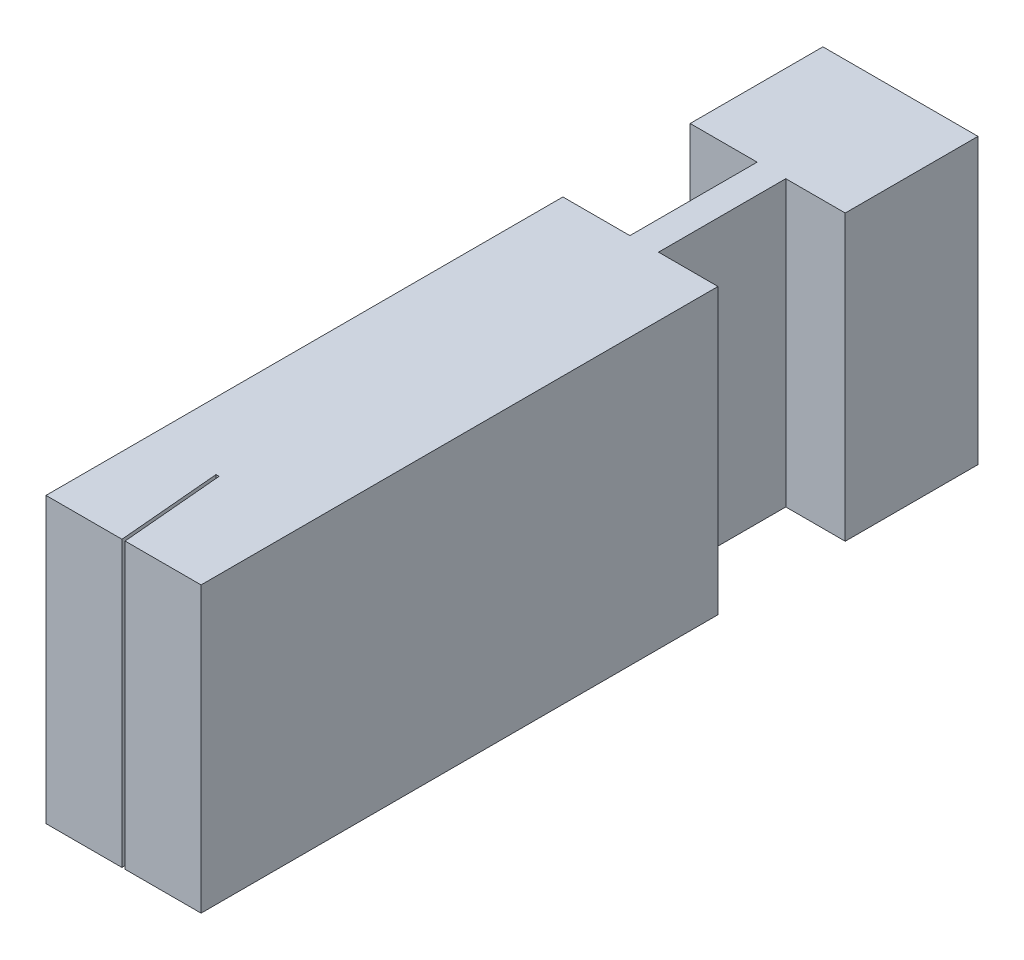
ISO-10303-21;
HEADER;
FILE_DESCRIPTION(('STEP AP214'),'2;1');
FILE_NAME('part.step','',(''),(''),'','','');
FILE_SCHEMA(('AUTOMOTIVE_DESIGN { 1 0 10303 214 1 1 1 1 }'));
ENDSEC;
DATA;
#1=APPLICATION_CONTEXT('core data for automotive mechanical design processes');
#2=APPLICATION_PROTOCOL_DEFINITION('international standard','automotive_design',2000,#1);
#3=PRODUCT_CONTEXT('',#1,'mechanical');
#4=PRODUCT('Part','Part','',(#3));
#5=PRODUCT_RELATED_PRODUCT_CATEGORY('part','',(#4));
#6=PRODUCT_DEFINITION_FORMATION('','',#4);
#7=PRODUCT_DEFINITION_CONTEXT('part definition',#1,'design');
#8=PRODUCT_DEFINITION('design','',#6,#7);
#9=PRODUCT_DEFINITION_SHAPE('','',#8);
#10=(LENGTH_UNIT() NAMED_UNIT(*) SI_UNIT(.MILLI.,.METRE.));
#11=(NAMED_UNIT(*) PLANE_ANGLE_UNIT() SI_UNIT($,.RADIAN.));
#12=(NAMED_UNIT(*) SI_UNIT($,.STERADIAN.) SOLID_ANGLE_UNIT());
#13=UNCERTAINTY_MEASURE_WITH_UNIT(LENGTH_MEASURE(1.E-05),#10,'distance_accuracy_value','');
#14=(GEOMETRIC_REPRESENTATION_CONTEXT(3) GLOBAL_UNCERTAINTY_ASSIGNED_CONTEXT((#13)) GLOBAL_UNIT_ASSIGNED_CONTEXT((#10,
#11,#12)) REPRESENTATION_CONTEXT('',''));
#15=CARTESIAN_POINT('',(0.,0.,0.));
#16=DIRECTION('',(0.,0.,1.));
#17=DIRECTION('',(1.,0.,0.));
#18=AXIS2_PLACEMENT_3D('',#15,#16,#17);
#19=CARTESIAN_POINT('',(-2.44711398691685E-06,55.,-100.));
#20=DIRECTION('',(1.,0.,-2.44711398691685E-08));
#21=DIRECTION('',(-2.44711398691685E-08,0.,-1.));
#22=AXIS2_PLACEMENT_3D('',#19,#20,#21);
#23=PLANE('',#22);
#24=DIRECTION('',(2.44711398691685E-08,0.,1.));
#25=VECTOR('',#24,1.);
#26=CARTESIAN_POINT('',(-2.44711398691685E-06,0.,-100.));
#27=LINE('',#26,#25);
#28=CARTESIAN_POINT('',(-2.44711398691685E-06,0.,-100.));
#29=VERTEX_POINT('',#28);
#30=CARTESIAN_POINT('',(0.,0.,0.));
#31=VERTEX_POINT('',#30);
#32=EDGE_CURVE('E194',#29,#31,#27,.T.);
#33=ORIENTED_EDGE('',*,*,#32,.T.);
#34=DIRECTION('',(0.,-1.,0.));
#35=VECTOR('',#34,1.);
#36=CARTESIAN_POINT('',(0.,55.,0.));
#37=LINE('',#36,#35);
#38=CARTESIAN_POINT('',(0.,55.,0.));
#39=VERTEX_POINT('',#38);
#40=EDGE_CURVE('E11',#39,#31,#37,.T.);
#41=ORIENTED_EDGE('',*,*,#40,.F.);
#42=DIRECTION('',(2.44711398691685E-08,0.,1.));
#43=VECTOR('',#42,1.);
#44=CARTESIAN_POINT('',(-2.44711398691685E-06,55.,-100.));
#45=LINE('',#44,#43);
#46=CARTESIAN_POINT('',(-2.44711398691685E-06,55.,-100.));
#47=VERTEX_POINT('',#46);
#48=EDGE_CURVE('E240',#47,#39,#45,.T.);
#49=ORIENTED_EDGE('',*,*,#48,.F.);
#50=DIRECTION('',(0.,-1.,0.));
#51=VECTOR('',#50,1.);
#52=CARTESIAN_POINT('',(-2.44711398691685E-06,55.,-100.));
#53=LINE('',#52,#51);
#54=EDGE_CURVE('E190',#47,#29,#53,.T.);
#55=ORIENTED_EDGE('',*,*,#54,.T.);
#56=EDGE_LOOP('',(#33,#41,#49,#55));
#57=FACE_BOUND('',#56,.T.);
#58=ADVANCED_FACE('F45',(#57),#23,.F.);
#59=CARTESIAN_POINT('',(0.,55.,0.));
#60=DIRECTION('',(0.,0.,-1.));
#61=DIRECTION('',(-1.,0.,0.));
#62=AXIS2_PLACEMENT_3D('',#59,#60,#61);
#63=PLANE('',#62);
#64=DIRECTION('',(1.,0.,0.));
#65=VECTOR('',#64,1.);
#66=CARTESIAN_POINT('',(0.,0.,0.));
#67=LINE('',#66,#65);
#68=CARTESIAN_POINT('',(14.7,0.,0.));
#69=VERTEX_POINT('',#68);
#70=EDGE_CURVE('E198',#31,#69,#67,.T.);
#71=ORIENTED_EDGE('',*,*,#70,.T.);
#72=DIRECTION('',(0.,-1.,0.));
#73=VECTOR('',#72,1.);
#74=CARTESIAN_POINT('',(14.7,55.,0.));
#75=LINE('',#74,#73);
#76=CARTESIAN_POINT('',(14.7,55.,0.));
#77=VERTEX_POINT('',#76);
#78=EDGE_CURVE('E54',#77,#69,#75,.T.);
#79=ORIENTED_EDGE('',*,*,#78,.F.);
#80=DIRECTION('',(1.,0.,0.));
#81=VECTOR('',#80,1.);
#82=CARTESIAN_POINT('',(0.,55.,0.));
#83=LINE('',#82,#81);
#84=EDGE_CURVE('E129',#39,#77,#83,.T.);
#85=ORIENTED_EDGE('',*,*,#84,.F.);
#86=ORIENTED_EDGE('',*,*,#40,.T.);
#87=EDGE_LOOP('',(#71,#79,#85,#86));
#88=FACE_BOUND('',#87,.T.);
#89=ADVANCED_FACE('F362',(#88),#63,.F.);
#90=CARTESIAN_POINT('',(14.7,55.,0.));
#91=DIRECTION('',(-0.996194698091746,0.,0.087155742747655));
#92=DIRECTION('',(0.087155742747655,0.,0.996194698091746));
#93=AXIS2_PLACEMENT_3D('',#90,#91,#92);
#94=PLANE('',#93);
#95=DIRECTION('',(-0.087155742747655,0.,-0.996194698091746));
#96=VECTOR('',#95,1.);
#97=CARTESIAN_POINT('',(14.7,0.,0.));
#98=LINE('',#97,#96);
#99=CARTESIAN_POINT('',(12.9568851450469,0.,-19.9238939618349));
#100=VERTEX_POINT('',#99);
#101=EDGE_CURVE('E201',#69,#100,#98,.T.);
#102=ORIENTED_EDGE('',*,*,#101,.T.);
#103=DIRECTION('',(0.,-1.,0.));
#104=VECTOR('',#103,1.);
#105=CARTESIAN_POINT('',(12.9568851450469,55.,-19.9238939618349));
#106=LINE('',#105,#104);
#107=CARTESIAN_POINT('',(12.9568851450469,55.,-19.9238939618349));
#108=VERTEX_POINT('',#107);
#109=EDGE_CURVE('E283',#108,#100,#106,.T.);
#110=ORIENTED_EDGE('',*,*,#109,.F.);
#111=DIRECTION('',(-0.087155742747655,0.,-0.996194698091746));
#112=VECTOR('',#111,1.);
#113=CARTESIAN_POINT('',(14.7,55.,0.));
#114=LINE('',#113,#112);
#115=EDGE_CURVE('E293',#77,#108,#114,.T.);
#116=ORIENTED_EDGE('',*,*,#115,.F.);
#117=ORIENTED_EDGE('',*,*,#78,.T.);
#118=EDGE_LOOP('',(#102,#110,#116,#117));
#119=FACE_BOUND('',#118,.T.);
#120=ADVANCED_FACE('F291',(#119),#94,.F.);
#121=CARTESIAN_POINT('',(12.9568851450469,55.,-19.9238939618349));
#122=DIRECTION('',(0.,0.,-1.));
#123=DIRECTION('',(-1.,0.,0.));
#124=AXIS2_PLACEMENT_3D('',#121,#122,#123);
#125=PLANE('',#124);
#126=DIRECTION('',(1.,0.,0.));
#127=VECTOR('',#126,1.);
#128=CARTESIAN_POINT('',(12.9568851450469,0.,-19.9238939618349));
#129=LINE('',#128,#127);
#130=CARTESIAN_POINT('',(13.5568851450469,0.,-19.9238939618349));
#131=VERTEX_POINT('',#130);
#132=EDGE_CURVE('E204',#100,#131,#129,.T.);
#133=ORIENTED_EDGE('',*,*,#132,.T.);
#134=DIRECTION('',(0.,-1.,0.));
#135=VECTOR('',#134,1.);
#136=CARTESIAN_POINT('',(13.5568851450469,55.,-19.9238939618349));
#137=LINE('',#136,#135);
#138=CARTESIAN_POINT('',(13.5568851450469,55.,-19.9238939618349));
#139=VERTEX_POINT('',#138);
#140=EDGE_CURVE('E279',#139,#131,#137,.T.);
#141=ORIENTED_EDGE('',*,*,#140,.F.);
#142=DIRECTION('',(1.,0.,0.));
#143=VECTOR('',#142,1.);
#144=CARTESIAN_POINT('',(12.9568851450469,55.,-19.9238939618349));
#145=LINE('',#144,#143);
#146=EDGE_CURVE('E312',#108,#139,#145,.T.);
#147=ORIENTED_EDGE('',*,*,#146,.F.);
#148=ORIENTED_EDGE('',*,*,#109,.T.);
#149=EDGE_LOOP('',(#133,#141,#147,#148));
#150=FACE_BOUND('',#149,.T.);
#151=ADVANCED_FACE('F302',(#150),#125,.F.);
#152=CARTESIAN_POINT('',(13.5568851450469,55.,-19.9238939618349));
#153=DIRECTION('',(0.996194698091746,0.,-0.0871557427476548));
#154=DIRECTION('',(-0.0871557427476548,0.,-0.996194698091746));
#155=AXIS2_PLACEMENT_3D('',#152,#153,#154);
#156=PLANE('',#155);
#157=DIRECTION('',(0.0871557427476548,0.,0.996194698091746));
#158=VECTOR('',#157,1.);
#159=CARTESIAN_POINT('',(13.5568851450469,0.,-19.9238939618349));
#160=LINE('',#159,#158);
#161=CARTESIAN_POINT('',(15.3,0.,0.));
#162=VERTEX_POINT('',#161);
#163=EDGE_CURVE('E207',#131,#162,#160,.T.);
#164=ORIENTED_EDGE('',*,*,#163,.T.);
#165=DIRECTION('',(0.,-1.,0.));
#166=VECTOR('',#165,1.);
#167=CARTESIAN_POINT('',(15.3,55.,0.));
#168=LINE('',#167,#166);
#169=CARTESIAN_POINT('',(15.3,55.,0.));
#170=VERTEX_POINT('',#169);
#171=EDGE_CURVE('E275',#170,#162,#168,.T.);
#172=ORIENTED_EDGE('',*,*,#171,.F.);
#173=DIRECTION('',(0.0871557427476548,0.,0.996194698091746));
#174=VECTOR('',#173,1.);
#175=CARTESIAN_POINT('',(13.5568851450469,55.,-19.9238939618349));
#176=LINE('',#175,#174);
#177=EDGE_CURVE('E308',#139,#170,#176,.T.);
#178=ORIENTED_EDGE('',*,*,#177,.F.);
#179=ORIENTED_EDGE('',*,*,#140,.T.);
#180=EDGE_LOOP('',(#164,#172,#178,#179));
#181=FACE_BOUND('',#180,.T.);
#182=ADVANCED_FACE('F306',(#181),#156,.F.);
#183=CARTESIAN_POINT('',(15.3,55.,0.));
#184=DIRECTION('',(0.,0.,-1.));
#185=DIRECTION('',(-1.,0.,0.));
#186=AXIS2_PLACEMENT_3D('',#183,#184,#185);
#187=PLANE('',#186);
#188=DIRECTION('',(1.,0.,0.));
#189=VECTOR('',#188,1.);
#190=CARTESIAN_POINT('',(15.3,0.,0.));
#191=LINE('',#190,#189);
#192=CARTESIAN_POINT('',(30.,0.,0.));
#193=VERTEX_POINT('',#192);
#194=EDGE_CURVE('E210',#162,#193,#191,.T.);
#195=ORIENTED_EDGE('',*,*,#194,.T.);
#196=DIRECTION('',(0.,-1.,0.));
#197=VECTOR('',#196,1.);
#198=CARTESIAN_POINT('',(30.,55.,0.));
#199=LINE('',#198,#197);
#200=CARTESIAN_POINT('',(30.,55.,0.));
#201=VERTEX_POINT('',#200);
#202=EDGE_CURVE('E271',#201,#193,#199,.T.);
#203=ORIENTED_EDGE('',*,*,#202,.F.);
#204=DIRECTION('',(1.,0.,0.));
#205=VECTOR('',#204,1.);
#206=CARTESIAN_POINT('',(15.3,55.,0.));
#207=LINE('',#206,#205);
#208=EDGE_CURVE('E311',#170,#201,#207,.T.);
#209=ORIENTED_EDGE('',*,*,#208,.F.);
#210=ORIENTED_EDGE('',*,*,#171,.T.);
#211=EDGE_LOOP('',(#195,#203,#209,#210));
#212=FACE_BOUND('',#211,.T.);
#213=ADVANCED_FACE('F375',(#212),#187,.F.);
#214=CARTESIAN_POINT('',(29.999997552886,55.,-100.));
#215=DIRECTION('',(-1.,0.,2.44711398714181E-08));
#216=DIRECTION('',(2.44711398714181E-08,0.,1.));
#217=AXIS2_PLACEMENT_3D('',#214,#215,#216);
#218=PLANE('',#217);
#219=DIRECTION('',(-2.44711398714181E-08,0.,-1.));
#220=VECTOR('',#219,1.);
#221=CARTESIAN_POINT('',(29.999997552886,0.,-100.));
#222=LINE('',#221,#220);
#223=CARTESIAN_POINT('',(29.999997552886,0.,-100.));
#224=VERTEX_POINT('',#223);
#225=EDGE_CURVE('E213',#193,#224,#222,.T.);
#226=ORIENTED_EDGE('',*,*,#225,.T.);
#227=DIRECTION('',(0.,-1.,0.));
#228=VECTOR('',#227,1.);
#229=CARTESIAN_POINT('',(29.999997552886,55.,-100.));
#230=LINE('',#229,#228);
#231=CARTESIAN_POINT('',(29.999997552886,55.,-100.));
#232=VERTEX_POINT('',#231);
#233=EDGE_CURVE('E267',#232,#224,#230,.T.);
#234=ORIENTED_EDGE('',*,*,#233,.F.);
#235=DIRECTION('',(-2.44711398714181E-08,0.,-1.));
#236=VECTOR('',#235,1.);
#237=CARTESIAN_POINT('',(29.999997552886,55.,-100.));
#238=LINE('',#237,#236);
#239=EDGE_CURVE('E316',#201,#232,#238,.T.);
#240=ORIENTED_EDGE('',*,*,#239,.F.);
#241=ORIENTED_EDGE('',*,*,#202,.T.);
#242=EDGE_LOOP('',(#226,#234,#240,#241));
#243=FACE_BOUND('',#242,.T.);
#244=ADVANCED_FACE('F378',(#243),#218,.F.);
#245=CARTESIAN_POINT('',(18.5012976037397,55.,-100.));
#246=DIRECTION('',(0.,0.,1.));
#247=DIRECTION('',(1.,0.,0.));
#248=AXIS2_PLACEMENT_3D('',#245,#246,#247);
#249=PLANE('',#248);
#250=DIRECTION('',(-1.,0.,0.));
#251=VECTOR('',#250,1.);
#252=CARTESIAN_POINT('',(18.5012976037397,0.,-100.));
#253=LINE('',#252,#251);
#254=CARTESIAN_POINT('',(18.5012976037397,0.,-100.));
#255=VERTEX_POINT('',#254);
#256=EDGE_CURVE('E216',#224,#255,#253,.T.);
#257=ORIENTED_EDGE('',*,*,#256,.T.);
#258=DIRECTION('',(0.,-1.,0.));
#259=VECTOR('',#258,1.);
#260=CARTESIAN_POINT('',(18.5012976037397,55.,-100.));
#261=LINE('',#260,#259);
#262=CARTESIAN_POINT('',(18.5012976037397,55.,-100.));
#263=VERTEX_POINT('',#262);
#264=EDGE_CURVE('E263',#263,#255,#261,.T.);
#265=ORIENTED_EDGE('',*,*,#264,.F.);
#266=DIRECTION('',(-1.,0.,0.));
#267=VECTOR('',#266,1.);
#268=CARTESIAN_POINT('',(18.5012976037397,55.,-100.));
#269=LINE('',#268,#267);
#270=EDGE_CURVE('E323',#232,#263,#269,.T.);
#271=ORIENTED_EDGE('',*,*,#270,.F.);
#272=ORIENTED_EDGE('',*,*,#233,.T.);
#273=EDGE_LOOP('',(#257,#265,#271,#272));
#274=FACE_BOUND('',#273,.T.);
#275=ADVANCED_FACE('F382',(#274),#249,.F.);
#276=CARTESIAN_POINT('',(18.5012976037397,55.,-124.616050595762));
#277=DIRECTION('',(-1.,0.,0.));
#278=DIRECTION('',(0.,0.,1.));
#279=AXIS2_PLACEMENT_3D('',#276,#277,#278);
#280=PLANE('',#279);
#281=DIRECTION('',(0.,0.,-1.));
#282=VECTOR('',#281,1.);
#283=CARTESIAN_POINT('',(18.5012976037397,0.,-124.616050595762));
#284=LINE('',#283,#282);
#285=CARTESIAN_POINT('',(18.5012976037397,0.,-124.616050595762));
#286=VERTEX_POINT('',#285);
#287=EDGE_CURVE('E219',#255,#286,#284,.T.);
#288=ORIENTED_EDGE('',*,*,#287,.T.);
#289=DIRECTION('',(0.,-1.,0.));
#290=VECTOR('',#289,1.);
#291=CARTESIAN_POINT('',(18.5012976037397,55.,-124.616050595762));
#292=LINE('',#291,#290);
#293=CARTESIAN_POINT('',(18.5012976037397,55.,-124.616050595762));
#294=VERTEX_POINT('',#293);
#295=EDGE_CURVE('E259',#294,#286,#292,.T.);
#296=ORIENTED_EDGE('',*,*,#295,.F.);
#297=DIRECTION('',(0.,0.,-1.));
#298=VECTOR('',#297,1.);
#299=CARTESIAN_POINT('',(18.5012976037397,55.,-124.616050595762));
#300=LINE('',#299,#298);
#301=EDGE_CURVE('E326',#263,#294,#300,.T.);
#302=ORIENTED_EDGE('',*,*,#301,.F.);
#303=ORIENTED_EDGE('',*,*,#264,.T.);
#304=EDGE_LOOP('',(#288,#296,#302,#303));
#305=FACE_BOUND('',#304,.T.);
#306=ADVANCED_FACE('F386',(#305),#280,.F.);
#307=CARTESIAN_POINT('',(29.999997552886,55.,-124.616050595762));
#308=DIRECTION('',(0.,0.,-1.));
#309=DIRECTION('',(-1.,0.,0.));
#310=AXIS2_PLACEMENT_3D('',#307,#308,#309);
#311=PLANE('',#310);
#312=DIRECTION('',(1.,0.,0.));
#313=VECTOR('',#312,1.);
#314=CARTESIAN_POINT('',(29.999997552886,0.,-124.616050595762));
#315=LINE('',#314,#313);
#316=CARTESIAN_POINT('',(29.999997552886,0.,-124.616050595762));
#317=VERTEX_POINT('',#316);
#318=EDGE_CURVE('E222',#286,#317,#315,.T.);
#319=ORIENTED_EDGE('',*,*,#318,.T.);
#320=DIRECTION('',(0.,-1.,0.));
#321=VECTOR('',#320,1.);
#322=CARTESIAN_POINT('',(29.999997552886,55.,-124.616050595762));
#323=LINE('',#322,#321);
#324=CARTESIAN_POINT('',(29.999997552886,55.,-124.616050595762));
#325=VERTEX_POINT('',#324);
#326=EDGE_CURVE('E255',#325,#317,#323,.T.);
#327=ORIENTED_EDGE('',*,*,#326,.F.);
#328=DIRECTION('',(1.,0.,0.));
#329=VECTOR('',#328,1.);
#330=CARTESIAN_POINT('',(29.999997552886,55.,-124.616050595762));
#331=LINE('',#330,#329);
#332=EDGE_CURVE('E329',#294,#325,#331,.T.);
#333=ORIENTED_EDGE('',*,*,#332,.F.);
#334=ORIENTED_EDGE('',*,*,#295,.T.);
#335=EDGE_LOOP('',(#319,#327,#333,#334));
#336=FACE_BOUND('',#335,.T.);
#337=ADVANCED_FACE('F390',(#336),#311,.F.);
#338=CARTESIAN_POINT('',(29.999997552886,55.,-150.302811840218));
#339=DIRECTION('',(-1.,0.,0.));
#340=DIRECTION('',(0.,0.,1.));
#341=AXIS2_PLACEMENT_3D('',#338,#339,#340);
#342=PLANE('',#341);
#343=DIRECTION('',(0.,0.,-1.));
#344=VECTOR('',#343,1.);
#345=CARTESIAN_POINT('',(29.999997552886,0.,-150.302811840218));
#346=LINE('',#345,#344);
#347=CARTESIAN_POINT('',(29.999997552886,0.,-150.302811840218));
#348=VERTEX_POINT('',#347);
#349=EDGE_CURVE('E225',#317,#348,#346,.T.);
#350=ORIENTED_EDGE('',*,*,#349,.T.);
#351=DIRECTION('',(0.,-1.,0.));
#352=VECTOR('',#351,1.);
#353=CARTESIAN_POINT('',(29.999997552886,55.,-150.302811840218));
#354=LINE('',#353,#352);
#355=CARTESIAN_POINT('',(29.999997552886,55.,-150.302811840218));
#356=VERTEX_POINT('',#355);
#357=EDGE_CURVE('E251',#356,#348,#354,.T.);
#358=ORIENTED_EDGE('',*,*,#357,.F.);
#359=DIRECTION('',(0.,0.,-1.));
#360=VECTOR('',#359,1.);
#361=CARTESIAN_POINT('',(29.999997552886,55.,-150.302811840218));
#362=LINE('',#361,#360);
#363=EDGE_CURVE('E332',#325,#356,#362,.T.);
#364=ORIENTED_EDGE('',*,*,#363,.F.);
#365=ORIENTED_EDGE('',*,*,#326,.T.);
#366=EDGE_LOOP('',(#350,#358,#364,#365));
#367=FACE_BOUND('',#366,.T.);
#368=ADVANCED_FACE('F394',(#367),#342,.F.);
#369=CARTESIAN_POINT('',(0.,55.,-150.302811840218));
#370=DIRECTION('',(0.,0.,1.));
#371=DIRECTION('',(1.,0.,0.));
#372=AXIS2_PLACEMENT_3D('',#369,#370,#371);
#373=PLANE('',#372);
#374=DIRECTION('',(-1.,0.,0.));
#375=VECTOR('',#374,1.);
#376=CARTESIAN_POINT('',(0.,0.,-150.302811840218));
#377=LINE('',#376,#375);
#378=CARTESIAN_POINT('',(0.,0.,-150.302811840218));
#379=VERTEX_POINT('',#378);
#380=EDGE_CURVE('E228',#348,#379,#377,.T.);
#381=ORIENTED_EDGE('',*,*,#380,.T.);
#382=DIRECTION('',(0.,-1.,0.));
#383=VECTOR('',#382,1.);
#384=CARTESIAN_POINT('',(0.,55.,-150.302811840218));
#385=LINE('',#384,#383);
#386=CARTESIAN_POINT('',(0.,55.,-150.302811840218));
#387=VERTEX_POINT('',#386);
#388=EDGE_CURVE('E247',#387,#379,#385,.T.);
#389=ORIENTED_EDGE('',*,*,#388,.F.);
#390=DIRECTION('',(-1.,0.,0.));
#391=VECTOR('',#390,1.);
#392=CARTESIAN_POINT('',(0.,55.,-150.302811840218));
#393=LINE('',#392,#391);
#394=EDGE_CURVE('E335',#356,#387,#393,.T.);
#395=ORIENTED_EDGE('',*,*,#394,.F.);
#396=ORIENTED_EDGE('',*,*,#357,.T.);
#397=EDGE_LOOP('',(#381,#389,#395,#396));
#398=FACE_BOUND('',#397,.T.);
#399=ADVANCED_FACE('F343',(#398),#373,.F.);
#400=CARTESIAN_POINT('',(0.,55.,-124.616050595762));
#401=DIRECTION('',(1.,0.,0.));
#402=DIRECTION('',(0.,0.,-1.));
#403=AXIS2_PLACEMENT_3D('',#400,#401,#402);
#404=PLANE('',#403);
#405=DIRECTION('',(0.,0.,1.));
#406=VECTOR('',#405,1.);
#407=CARTESIAN_POINT('',(0.,0.,-124.616050595762));
#408=LINE('',#407,#406);
#409=CARTESIAN_POINT('',(0.,0.,-124.616050595762));
#410=VERTEX_POINT('',#409);
#411=EDGE_CURVE('E231',#379,#410,#408,.T.);
#412=ORIENTED_EDGE('',*,*,#411,.T.);
#413=DIRECTION('',(0.,-1.,0.));
#414=VECTOR('',#413,1.);
#415=CARTESIAN_POINT('',(0.,55.,-124.616050595762));
#416=LINE('',#415,#414);
#417=CARTESIAN_POINT('',(0.,55.,-124.616050595762));
#418=VERTEX_POINT('',#417);
#419=EDGE_CURVE('E183',#418,#410,#416,.T.);
#420=ORIENTED_EDGE('',*,*,#419,.F.);
#421=DIRECTION('',(0.,0.,1.));
#422=VECTOR('',#421,1.);
#423=CARTESIAN_POINT('',(0.,55.,-124.616050595762));
#424=LINE('',#423,#422);
#425=EDGE_CURVE('E172',#387,#418,#424,.T.);
#426=ORIENTED_EDGE('',*,*,#425,.F.);
#427=ORIENTED_EDGE('',*,*,#388,.T.);
#428=EDGE_LOOP('',(#412,#420,#426,#427));
#429=FACE_BOUND('',#428,.T.);
#430=ADVANCED_FACE('F347',(#429),#404,.F.);
#431=CARTESIAN_POINT('',(12.9568851450469,55.,-124.616050595762));
#432=DIRECTION('',(0.,0.,-1.));
#433=DIRECTION('',(-1.,0.,0.));
#434=AXIS2_PLACEMENT_3D('',#431,#432,#433);
#435=PLANE('',#434);
#436=DIRECTION('',(1.,0.,0.));
#437=VECTOR('',#436,1.);
#438=CARTESIAN_POINT('',(12.9568851450469,0.,-124.616050595762));
#439=LINE('',#438,#437);
#440=CARTESIAN_POINT('',(12.9568851450469,0.,-124.616050595762));
#441=VERTEX_POINT('',#440);
#442=EDGE_CURVE('E181',#410,#441,#439,.T.);
#443=ORIENTED_EDGE('',*,*,#442,.T.);
#444=DIRECTION('',(0.,-1.,0.));
#445=VECTOR('',#444,1.);
#446=CARTESIAN_POINT('',(12.9568851450469,55.,-124.616050595762));
#447=LINE('',#446,#445);
#448=CARTESIAN_POINT('',(12.9568851450469,55.,-124.616050595762));
#449=VERTEX_POINT('',#448);
#450=EDGE_CURVE('E178',#449,#441,#447,.T.);
#451=ORIENTED_EDGE('',*,*,#450,.F.);
#452=DIRECTION('',(1.,0.,0.));
#453=VECTOR('',#452,1.);
#454=CARTESIAN_POINT('',(12.9568851450469,55.,-124.616050595762));
#455=LINE('',#454,#453);
#456=EDGE_CURVE('E166',#418,#449,#455,.T.);
#457=ORIENTED_EDGE('',*,*,#456,.F.);
#458=ORIENTED_EDGE('',*,*,#419,.T.);
#459=EDGE_LOOP('',(#443,#451,#457,#458));
#460=FACE_BOUND('',#459,.T.);
#461=ADVANCED_FACE('F179',(#460),#435,.F.);
#462=CARTESIAN_POINT('',(12.9568851450469,55.,-100.));
#463=DIRECTION('',(1.,0.,0.));
#464=DIRECTION('',(0.,0.,-1.));
#465=AXIS2_PLACEMENT_3D('',#462,#463,#464);
#466=PLANE('',#465);
#467=DIRECTION('',(0.,0.,1.));
#468=VECTOR('',#467,1.);
#469=CARTESIAN_POINT('',(12.9568851450469,0.,-100.));
#470=LINE('',#469,#468);
#471=CARTESIAN_POINT('',(12.9568851450469,0.,-100.));
#472=VERTEX_POINT('',#471);
#473=EDGE_CURVE('E115',#441,#472,#470,.T.);
#474=ORIENTED_EDGE('',*,*,#473,.T.);
#475=DIRECTION('',(0.,-1.,0.));
#476=VECTOR('',#475,1.);
#477=CARTESIAN_POINT('',(12.9568851450469,55.,-100.));
#478=LINE('',#477,#476);
#479=CARTESIAN_POINT('',(12.9568851450469,55.,-100.));
#480=VERTEX_POINT('',#479);
#481=EDGE_CURVE('E184',#480,#472,#478,.T.);
#482=ORIENTED_EDGE('',*,*,#481,.F.);
#483=DIRECTION('',(0.,0.,1.));
#484=VECTOR('',#483,1.);
#485=CARTESIAN_POINT('',(12.9568851450469,55.,-100.));
#486=LINE('',#485,#484);
#487=EDGE_CURVE('E170',#449,#480,#486,.T.);
#488=ORIENTED_EDGE('',*,*,#487,.F.);
#489=ORIENTED_EDGE('',*,*,#450,.T.);
#490=EDGE_LOOP('',(#474,#482,#488,#489));
#491=FACE_BOUND('',#490,.T.);
#492=ADVANCED_FACE('F186',(#491),#466,.F.);
#493=CARTESIAN_POINT('',(-2.44711398691685E-06,55.,-100.));
#494=DIRECTION('',(0.,0.,1.));
#495=DIRECTION('',(1.,0.,0.));
#496=AXIS2_PLACEMENT_3D('',#493,#494,#495);
#497=PLANE('',#496);
#498=DIRECTION('',(-1.,0.,0.));
#499=VECTOR('',#498,1.);
#500=CARTESIAN_POINT('',(-2.44711398691685E-06,0.,-100.));
#501=LINE('',#500,#499);
#502=EDGE_CURVE('E121',#472,#29,#501,.T.);
#503=ORIENTED_EDGE('',*,*,#502,.T.);
#504=ORIENTED_EDGE('',*,*,#54,.F.);
#505=DIRECTION('',(-1.,0.,0.));
#506=VECTOR('',#505,1.);
#507=CARTESIAN_POINT('',(-2.44711398691685E-06,55.,-100.));
#508=LINE('',#507,#506);
#509=EDGE_CURVE('E62',#480,#47,#508,.T.);
#510=ORIENTED_EDGE('',*,*,#509,.F.);
#511=ORIENTED_EDGE('',*,*,#481,.T.);
#512=EDGE_LOOP('',(#503,#504,#510,#511));
#513=FACE_BOUND('',#512,.T.);
#514=ADVANCED_FACE('F351',(#513),#497,.F.);
#515=CARTESIAN_POINT('',(0.,55.,0.));
#516=DIRECTION('',(0.,1.,0.));
#517=DIRECTION('',(0.,0.,1.));
#518=AXIS2_PLACEMENT_3D('',#515,#516,#517);
#519=PLANE('',#518);
#520=ORIENTED_EDGE('',*,*,#48,.T.);
#521=ORIENTED_EDGE('',*,*,#84,.T.);
#522=ORIENTED_EDGE('',*,*,#115,.T.);
#523=ORIENTED_EDGE('',*,*,#146,.T.);
#524=ORIENTED_EDGE('',*,*,#177,.T.);
#525=ORIENTED_EDGE('',*,*,#208,.T.);
#526=ORIENTED_EDGE('',*,*,#239,.T.);
#527=ORIENTED_EDGE('',*,*,#270,.T.);
#528=ORIENTED_EDGE('',*,*,#301,.T.);
#529=ORIENTED_EDGE('',*,*,#332,.T.);
#530=ORIENTED_EDGE('',*,*,#363,.T.);
#531=ORIENTED_EDGE('',*,*,#394,.T.);
#532=ORIENTED_EDGE('',*,*,#425,.T.);
#533=ORIENTED_EDGE('',*,*,#456,.T.);
#534=ORIENTED_EDGE('',*,*,#487,.T.);
#535=ORIENTED_EDGE('',*,*,#509,.T.);
#536=EDGE_LOOP('',(#520,#521,#522,#523,#524,#525,#526,#527,#528,#529,#530,#531,#532,#533,#534,#535));
#537=FACE_BOUND('',#536,.T.);
#538=ADVANCED_FACE('F168',(#537),#519,.T.);
#539=CARTESIAN_POINT('',(0.,0.,0.));
#540=DIRECTION('',(0.,1.,0.));
#541=DIRECTION('',(0.,0.,1.));
#542=AXIS2_PLACEMENT_3D('',#539,#540,#541);
#543=PLANE('',#542);
#544=ORIENTED_EDGE('',*,*,#32,.F.);
#545=ORIENTED_EDGE('',*,*,#502,.F.);
#546=ORIENTED_EDGE('',*,*,#473,.F.);
#547=ORIENTED_EDGE('',*,*,#442,.F.);
#548=ORIENTED_EDGE('',*,*,#411,.F.);
#549=ORIENTED_EDGE('',*,*,#380,.F.);
#550=ORIENTED_EDGE('',*,*,#349,.F.);
#551=ORIENTED_EDGE('',*,*,#318,.F.);
#552=ORIENTED_EDGE('',*,*,#287,.F.);
#553=ORIENTED_EDGE('',*,*,#256,.F.);
#554=ORIENTED_EDGE('',*,*,#225,.F.);
#555=ORIENTED_EDGE('',*,*,#194,.F.);
#556=ORIENTED_EDGE('',*,*,#163,.F.);
#557=ORIENTED_EDGE('',*,*,#132,.F.);
#558=ORIENTED_EDGE('',*,*,#101,.F.);
#559=ORIENTED_EDGE('',*,*,#70,.F.);
#560=EDGE_LOOP('',(#544,#545,#546,#547,#548,#549,#550,#551,#552,#553,#554,#555,#556,#557,#558,#559));
#561=FACE_BOUND('',#560,.T.);
#562=ADVANCED_FACE('F297',(#561),#543,.F.);
#563=CLOSED_SHELL('',(#58,#89,#120,#151,#182,#213,#244,#275,#306,#337,#368,#399,#430,#461,#492,
#514,#538,#562));
#564=MANIFOLD_SOLID_BREP('B2',#563);
#565=ADVANCED_BREP_SHAPE_REPRESENTATION('',(#18,#564),#14);
#566=SHAPE_DEFINITION_REPRESENTATION(#9,#565);
ENDSEC;
END-ISO-10303-21;
